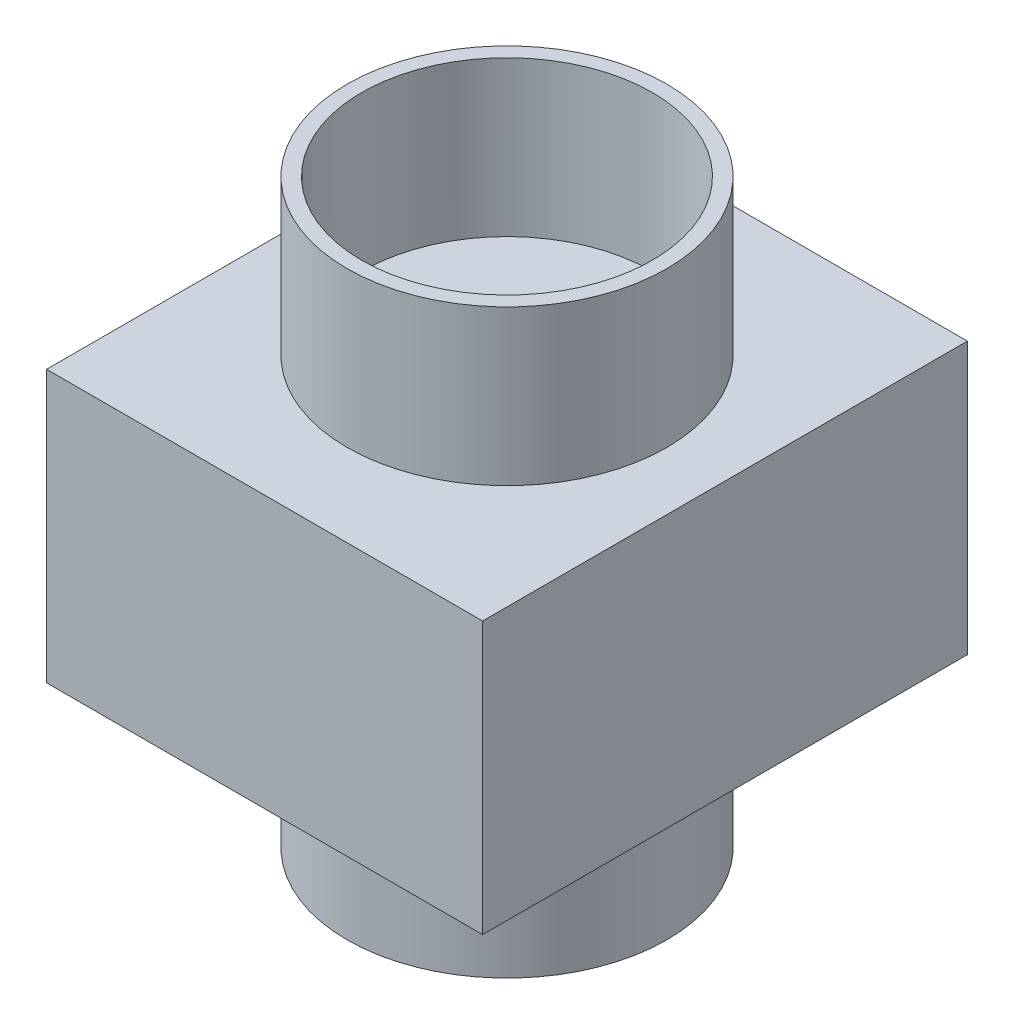
ISO-10303-21;
HEADER;
FILE_DESCRIPTION(('STEP AP214'),'2;1');
FILE_NAME('part.step','',(''),(''),'','','');
FILE_SCHEMA(('AUTOMOTIVE_DESIGN { 1 0 10303 214 1 1 1 1 }'));
ENDSEC;
DATA;
#1=APPLICATION_CONTEXT('core data for automotive mechanical design processes');
#2=APPLICATION_PROTOCOL_DEFINITION('international standard','automotive_design',2000,#1);
#3=PRODUCT_CONTEXT('',#1,'mechanical');
#4=PRODUCT('Part','Part','',(#3));
#5=PRODUCT_RELATED_PRODUCT_CATEGORY('part','',(#4));
#6=PRODUCT_DEFINITION_FORMATION('','',#4);
#7=PRODUCT_DEFINITION_CONTEXT('part definition',#1,'design');
#8=PRODUCT_DEFINITION('design','',#6,#7);
#9=PRODUCT_DEFINITION_SHAPE('','',#8);
#10=(LENGTH_UNIT() NAMED_UNIT(*) SI_UNIT(.MILLI.,.METRE.));
#11=(NAMED_UNIT(*) PLANE_ANGLE_UNIT() SI_UNIT($,.RADIAN.));
#12=(NAMED_UNIT(*) SI_UNIT($,.STERADIAN.) SOLID_ANGLE_UNIT());
#13=UNCERTAINTY_MEASURE_WITH_UNIT(LENGTH_MEASURE(1.E-05),#10,'distance_accuracy_value','');
#14=(GEOMETRIC_REPRESENTATION_CONTEXT(3) GLOBAL_UNCERTAINTY_ASSIGNED_CONTEXT((#13)) GLOBAL_UNIT_ASSIGNED_CONTEXT((#10,
#11,#12)) REPRESENTATION_CONTEXT('',''));
#15=CARTESIAN_POINT('',(0.,0.,0.));
#16=DIRECTION('',(0.,0.,1.));
#17=DIRECTION('',(1.,0.,0.));
#18=AXIS2_PLACEMENT_3D('',#15,#16,#17);
#19=CARTESIAN_POINT('',(0.,20.,0.));
#20=DIRECTION('',(0.,-1.,0.));
#21=DIRECTION('',(0.,0.,-1.));
#22=AXIS2_PLACEMENT_3D('',#19,#20,#21);
#23=CYLINDRICAL_SURFACE('',#22,11.);
#24=CARTESIAN_POINT('',(0.,-20.,0.));
#25=DIRECTION('',(0.,1.,0.));
#26=DIRECTION('',(0.,0.,1.));
#27=AXIS2_PLACEMENT_3D('',#24,#25,#26);
#28=CIRCLE('',#27,11.);
#29=CARTESIAN_POINT('',(0.,-20.,11.));
#30=VERTEX_POINT('',#29);
#31=EDGE_CURVE('E122',#30,#30,#28,.T.);
#32=ORIENTED_EDGE('',*,*,#31,.T.);
#33=EDGE_LOOP('',(#32));
#34=FACE_BOUND('',#33,.T.);
#35=CARTESIAN_POINT('',(0.,-9.3436051978162,0.));
#36=DIRECTION('',(0.,1.,0.));
#37=DIRECTION('',(0.,0.,1.));
#38=AXIS2_PLACEMENT_3D('',#35,#36,#37);
#39=CIRCLE('',#38,11.);
#40=CARTESIAN_POINT('',(0.,-9.3436051978162,11.));
#41=VERTEX_POINT('',#40);
#42=EDGE_CURVE('E11',#41,#41,#39,.T.);
#43=ORIENTED_EDGE('',*,*,#42,.F.);
#44=EDGE_LOOP('',(#43));
#45=FACE_BOUND('',#44,.T.);
#46=ADVANCED_FACE('F37',(#34,#45),#23,.T.);
#47=CARTESIAN_POINT('',(0.,20.,0.));
#48=DIRECTION('',(0.,-1.,0.));
#49=DIRECTION('',(0.,0.,-1.));
#50=AXIS2_PLACEMENT_3D('',#47,#48,#49);
#51=CYLINDRICAL_SURFACE('',#50,10.);
#52=CARTESIAN_POINT('',(0.,-20.,0.));
#53=DIRECTION('',(0.,1.,0.));
#54=DIRECTION('',(0.,0.,1.));
#55=AXIS2_PLACEMENT_3D('',#52,#53,#54);
#56=CIRCLE('',#55,10.);
#57=CARTESIAN_POINT('',(0.,-20.,10.));
#58=VERTEX_POINT('',#57);
#59=EDGE_CURVE('E123',#58,#58,#56,.T.);
#60=ORIENTED_EDGE('',*,*,#59,.F.);
#61=EDGE_LOOP('',(#60));
#62=FACE_BOUND('',#61,.T.);
#63=CARTESIAN_POINT('',(0.,-9.3436051978162,0.));
#64=DIRECTION('',(0.,1.,0.));
#65=DIRECTION('',(0.,0.,1.));
#66=AXIS2_PLACEMENT_3D('',#63,#64,#65);
#67=CIRCLE('',#66,10.);
#68=CARTESIAN_POINT('',(0.,-9.3436051978162,10.));
#69=VERTEX_POINT('',#68);
#70=EDGE_CURVE('E40',#69,#69,#67,.T.);
#71=ORIENTED_EDGE('',*,*,#70,.T.);
#72=EDGE_LOOP('',(#71));
#73=FACE_BOUND('',#72,.T.);
#74=ADVANCED_FACE('F135',(#62,#73),#51,.F.);
#75=CARTESIAN_POINT('',(0.,-20.,0.));
#76=DIRECTION('',(0.,1.,0.));
#77=DIRECTION('',(0.,0.,1.));
#78=AXIS2_PLACEMENT_3D('',#75,#76,#77);
#79=PLANE('',#78);
#80=ORIENTED_EDGE('',*,*,#31,.F.);
#81=EDGE_LOOP('',(#80));
#82=FACE_BOUND('',#81,.T.);
#83=ORIENTED_EDGE('',*,*,#59,.T.);
#84=EDGE_LOOP('',(#83));
#85=FACE_BOUND('',#84,.T.);
#86=ADVANCED_FACE('F140',(#82,#85),#79,.F.);
#87=CARTESIAN_POINT('',(15.,-9.3436051978162,-16.6790325620719));
#88=DIRECTION('',(0.,1.,0.));
#89=DIRECTION('',(0.,0.,1.));
#90=AXIS2_PLACEMENT_3D('',#87,#88,#89);
#91=PLANE('',#90);
#92=ORIENTED_EDGE('',*,*,#70,.F.);
#93=EDGE_LOOP('',(#92));
#94=FACE_BOUND('',#93,.T.);
#95=ADVANCED_FACE('F137',(#94),#91,.F.);
#96=CARTESIAN_POINT('',(15.,9.3436051978162,16.6790325620719));
#97=DIRECTION('',(0.,0.,-1.));
#98=DIRECTION('',(-1.,0.,0.));
#99=AXIS2_PLACEMENT_3D('',#96,#97,#98);
#100=PLANE('',#99);
#101=DIRECTION('',(0.,-1.,0.));
#102=VECTOR('',#101,1.);
#103=CARTESIAN_POINT('',(-15.,9.3436051978162,16.6790325620719));
#104=LINE('',#103,#102);
#105=CARTESIAN_POINT('',(-15.,9.3436051978162,16.6790325620719));
#106=VERTEX_POINT('',#105);
#107=CARTESIAN_POINT('',(-15.,-9.3436051978162,16.6790325620719));
#108=VERTEX_POINT('',#107);
#109=EDGE_CURVE('E106',#106,#108,#104,.T.);
#110=ORIENTED_EDGE('',*,*,#109,.T.);
#111=DIRECTION('',(-1.,0.,0.));
#112=VECTOR('',#111,1.);
#113=CARTESIAN_POINT('',(15.,-9.3436051978162,16.6790325620719));
#114=LINE('',#113,#112);
#115=CARTESIAN_POINT('',(15.,-9.3436051978162,16.6790325620719));
#116=VERTEX_POINT('',#115);
#117=EDGE_CURVE('E97',#116,#108,#114,.T.);
#118=ORIENTED_EDGE('',*,*,#117,.F.);
#119=DIRECTION('',(0.,-1.,0.));
#120=VECTOR('',#119,1.);
#121=CARTESIAN_POINT('',(15.,9.3436051978162,16.6790325620719));
#122=LINE('',#121,#120);
#123=CARTESIAN_POINT('',(15.,9.3436051978162,16.6790325620719));
#124=VERTEX_POINT('',#123);
#125=EDGE_CURVE('E91',#124,#116,#122,.T.);
#126=ORIENTED_EDGE('',*,*,#125,.F.);
#127=DIRECTION('',(-1.,0.,0.));
#128=VECTOR('',#127,1.);
#129=CARTESIAN_POINT('',(15.,9.3436051978162,16.6790325620719));
#130=LINE('',#129,#128);
#131=EDGE_CURVE('E102',#124,#106,#130,.T.);
#132=ORIENTED_EDGE('',*,*,#131,.T.);
#133=EDGE_LOOP('',(#110,#118,#126,#132));
#134=FACE_BOUND('',#133,.T.);
#135=ADVANCED_FACE('F139',(#134),#100,.F.);
#136=ORIENTED_EDGE('',*,*,#42,.T.);
#137=EDGE_LOOP('',(#136));
#138=FACE_BOUND('',#137,.T.);
#139=DIRECTION('',(0.,0.,-1.));
#140=VECTOR('',#139,1.);
#141=CARTESIAN_POINT('',(-15.,-9.3436051978162,-16.6790325620719));
#142=LINE('',#141,#140);
#143=CARTESIAN_POINT('',(-15.,-9.3436051978162,-16.6790325620719));
#144=VERTEX_POINT('',#143);
#145=EDGE_CURVE('E96',#108,#144,#142,.T.);
#146=ORIENTED_EDGE('',*,*,#145,.T.);
#147=DIRECTION('',(-1.,0.,0.));
#148=VECTOR('',#147,1.);
#149=CARTESIAN_POINT('',(15.,-9.3436051978162,-16.6790325620719));
#150=LINE('',#149,#148);
#151=CARTESIAN_POINT('',(15.,-9.3436051978162,-16.6790325620719));
#152=VERTEX_POINT('',#151);
#153=EDGE_CURVE('E94',#152,#144,#150,.T.);
#154=ORIENTED_EDGE('',*,*,#153,.F.);
#155=DIRECTION('',(0.,0.,-1.));
#156=VECTOR('',#155,1.);
#157=CARTESIAN_POINT('',(15.,-9.3436051978162,-16.6790325620719));
#158=LINE('',#157,#156);
#159=EDGE_CURVE('E86',#116,#152,#158,.T.);
#160=ORIENTED_EDGE('',*,*,#159,.F.);
#161=ORIENTED_EDGE('',*,*,#117,.T.);
#162=EDGE_LOOP('',(#146,#154,#160,#161));
#163=FACE_BOUND('',#162,.T.);
#164=ADVANCED_FACE('F95',(#138,#163),#91,.F.);
#165=CARTESIAN_POINT('',(15.,9.3436051978162,-16.6790325620719));
#166=DIRECTION('',(0.,0.,1.));
#167=DIRECTION('',(1.,0.,0.));
#168=AXIS2_PLACEMENT_3D('',#165,#166,#167);
#169=PLANE('',#168);
#170=DIRECTION('',(0.,1.,0.));
#171=VECTOR('',#170,1.);
#172=CARTESIAN_POINT('',(-15.,9.3436051978162,-16.6790325620719));
#173=LINE('',#172,#171);
#174=CARTESIAN_POINT('',(-15.,9.3436051978162,-16.6790325620719));
#175=VERTEX_POINT('',#174);
#176=EDGE_CURVE('E72',#144,#175,#173,.T.);
#177=ORIENTED_EDGE('',*,*,#176,.T.);
#178=DIRECTION('',(-1.,0.,0.));
#179=VECTOR('',#178,1.);
#180=CARTESIAN_POINT('',(15.,9.3436051978162,-16.6790325620719));
#181=LINE('',#180,#179);
#182=CARTESIAN_POINT('',(15.,9.3436051978162,-16.6790325620719));
#183=VERTEX_POINT('',#182);
#184=EDGE_CURVE('E98',#183,#175,#181,.T.);
#185=ORIENTED_EDGE('',*,*,#184,.F.);
#186=DIRECTION('',(0.,1.,0.));
#187=VECTOR('',#186,1.);
#188=CARTESIAN_POINT('',(15.,9.3436051978162,-16.6790325620719));
#189=LINE('',#188,#187);
#190=EDGE_CURVE('E89',#152,#183,#189,.T.);
#191=ORIENTED_EDGE('',*,*,#190,.F.);
#192=ORIENTED_EDGE('',*,*,#153,.T.);
#193=EDGE_LOOP('',(#177,#185,#191,#192));
#194=FACE_BOUND('',#193,.T.);
#195=ADVANCED_FACE('F100',(#194),#169,.F.);
#196=CARTESIAN_POINT('',(15.,9.3436051978162,-16.6790325620719));
#197=DIRECTION('',(0.,-1.,0.));
#198=DIRECTION('',(0.,0.,-1.));
#199=AXIS2_PLACEMENT_3D('',#196,#197,#198);
#200=PLANE('',#199);
#201=CARTESIAN_POINT('',(0.,9.3436051978162,0.));
#202=DIRECTION('',(0.,-1.,0.));
#203=DIRECTION('',(0.,0.,-1.));
#204=AXIS2_PLACEMENT_3D('',#201,#202,#203);
#205=CIRCLE('',#204,11.);
#206=CARTESIAN_POINT('',(0.,9.3436051978162,-11.));
#207=VERTEX_POINT('',#206);
#208=EDGE_CURVE('E46',#207,#207,#205,.T.);
#209=ORIENTED_EDGE('',*,*,#208,.T.);
#210=EDGE_LOOP('',(#209));
#211=FACE_BOUND('',#210,.T.);
#212=DIRECTION('',(0.,0.,1.));
#213=VECTOR('',#212,1.);
#214=CARTESIAN_POINT('',(-15.,9.3436051978162,-16.6790325620719));
#215=LINE('',#214,#213);
#216=EDGE_CURVE('E78',#175,#106,#215,.T.);
#217=ORIENTED_EDGE('',*,*,#216,.T.);
#218=ORIENTED_EDGE('',*,*,#131,.F.);
#219=DIRECTION('',(0.,0.,1.));
#220=VECTOR('',#219,1.);
#221=CARTESIAN_POINT('',(15.,9.3436051978162,-16.6790325620719));
#222=LINE('',#221,#220);
#223=EDGE_CURVE('E55',#183,#124,#222,.T.);
#224=ORIENTED_EDGE('',*,*,#223,.F.);
#225=ORIENTED_EDGE('',*,*,#184,.T.);
#226=EDGE_LOOP('',(#217,#218,#224,#225));
#227=FACE_BOUND('',#226,.T.);
#228=ADVANCED_FACE('F178',(#211,#227),#200,.F.);
#229=CARTESIAN_POINT('',(15.,0.,0.));
#230=DIRECTION('',(-1.,0.,0.));
#231=DIRECTION('',(0.,0.,1.));
#232=AXIS2_PLACEMENT_3D('',#229,#230,#231);
#233=PLANE('',#232);
#234=ORIENTED_EDGE('',*,*,#125,.T.);
#235=ORIENTED_EDGE('',*,*,#159,.T.);
#236=ORIENTED_EDGE('',*,*,#190,.T.);
#237=ORIENTED_EDGE('',*,*,#223,.T.);
#238=EDGE_LOOP('',(#234,#235,#236,#237));
#239=FACE_BOUND('',#238,.T.);
#240=ADVANCED_FACE('F87',(#239),#233,.F.);
#241=CARTESIAN_POINT('',(-15.,0.,0.));
#242=DIRECTION('',(-1.,0.,0.));
#243=DIRECTION('',(0.,0.,1.));
#244=AXIS2_PLACEMENT_3D('',#241,#242,#243);
#245=PLANE('',#244);
#246=ORIENTED_EDGE('',*,*,#109,.F.);
#247=ORIENTED_EDGE('',*,*,#216,.F.);
#248=ORIENTED_EDGE('',*,*,#176,.F.);
#249=ORIENTED_EDGE('',*,*,#145,.F.);
#250=EDGE_LOOP('',(#246,#247,#248,#249));
#251=FACE_BOUND('',#250,.T.);
#252=ADVANCED_FACE('F164',(#251),#245,.T.);
#253=CARTESIAN_POINT('',(0.,20.,0.));
#254=DIRECTION('',(0.,1.,0.));
#255=DIRECTION('',(0.,0.,1.));
#256=AXIS2_PLACEMENT_3D('',#253,#254,#255);
#257=CIRCLE('',#256,11.);
#258=CARTESIAN_POINT('',(0.,20.,11.));
#259=VERTEX_POINT('',#258);
#260=EDGE_CURVE('E117',#259,#259,#257,.T.);
#261=ORIENTED_EDGE('',*,*,#260,.F.);
#262=EDGE_LOOP('',(#261));
#263=FACE_BOUND('',#262,.T.);
#264=ORIENTED_EDGE('',*,*,#208,.F.);
#265=EDGE_LOOP('',(#264));
#266=FACE_BOUND('',#265,.T.);
#267=ADVANCED_FACE('F154',(#263,#266),#23,.T.);
#268=CARTESIAN_POINT('',(0.,20.,0.));
#269=DIRECTION('',(0.,1.,0.));
#270=DIRECTION('',(0.,0.,1.));
#271=AXIS2_PLACEMENT_3D('',#268,#269,#270);
#272=PLANE('',#271);
#273=ORIENTED_EDGE('',*,*,#260,.T.);
#274=EDGE_LOOP('',(#273));
#275=FACE_BOUND('',#274,.T.);
#276=CARTESIAN_POINT('',(0.,20.,0.));
#277=DIRECTION('',(0.,1.,0.));
#278=DIRECTION('',(0.,0.,1.));
#279=AXIS2_PLACEMENT_3D('',#276,#277,#278);
#280=CIRCLE('',#279,10.);
#281=CARTESIAN_POINT('',(0.,20.,10.));
#282=VERTEX_POINT('',#281);
#283=EDGE_CURVE('E119',#282,#282,#280,.T.);
#284=ORIENTED_EDGE('',*,*,#283,.F.);
#285=EDGE_LOOP('',(#284));
#286=FACE_BOUND('',#285,.T.);
#287=ADVANCED_FACE('F163',(#275,#286),#272,.T.);
#288=ORIENTED_EDGE('',*,*,#283,.T.);
#289=EDGE_LOOP('',(#288));
#290=FACE_BOUND('',#289,.T.);
#291=CARTESIAN_POINT('',(0.,9.3436051978162,0.));
#292=DIRECTION('',(0.,-1.,0.));
#293=DIRECTION('',(0.,0.,-1.));
#294=AXIS2_PLACEMENT_3D('',#291,#292,#293);
#295=CIRCLE('',#294,10.);
#296=CARTESIAN_POINT('',(0.,9.3436051978162,-10.));
#297=VERTEX_POINT('',#296);
#298=EDGE_CURVE('E115',#297,#297,#295,.T.);
#299=ORIENTED_EDGE('',*,*,#298,.T.);
#300=EDGE_LOOP('',(#299));
#301=FACE_BOUND('',#300,.T.);
#302=ADVANCED_FACE('F160',(#290,#301),#51,.F.);
#303=ORIENTED_EDGE('',*,*,#298,.F.);
#304=EDGE_LOOP('',(#303));
#305=FACE_BOUND('',#304,.T.);
#306=ADVANCED_FACE('F181',(#305),#200,.F.);
#307=CLOSED_SHELL('',(#46,#74,#86,#95,#135,#164,#195,#228,#240,#252,#267,#287,#302,#306));
#308=MANIFOLD_SOLID_BREP('B2',#307);
#309=ADVANCED_BREP_SHAPE_REPRESENTATION('',(#18,#308),#14);
#310=SHAPE_DEFINITION_REPRESENTATION(#9,#309);
ENDSEC;
END-ISO-10303-21;
